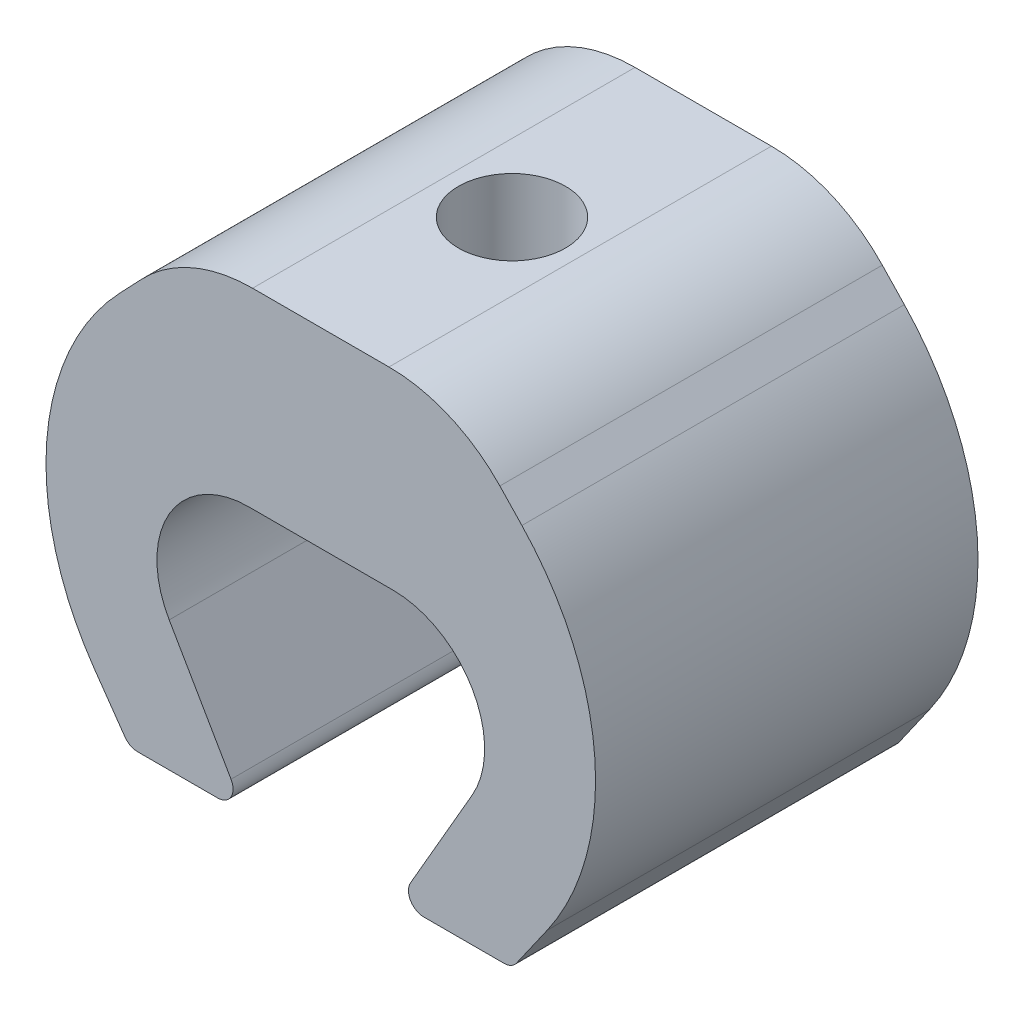
ISO-10303-21;
HEADER;
FILE_DESCRIPTION(('STEP AP214'),'2;1');
FILE_NAME('part.step','',(''),(''),'','','');
FILE_SCHEMA(('AUTOMOTIVE_DESIGN { 1 0 10303 214 1 1 1 1 }'));
ENDSEC;
DATA;
#1=APPLICATION_CONTEXT('core data for automotive mechanical design processes');
#2=APPLICATION_PROTOCOL_DEFINITION('international standard','automotive_design',2000,#1);
#3=PRODUCT_CONTEXT('',#1,'mechanical');
#4=PRODUCT('Part','Part','',(#3));
#5=PRODUCT_RELATED_PRODUCT_CATEGORY('part','',(#4));
#6=PRODUCT_DEFINITION_FORMATION('','',#4);
#7=PRODUCT_DEFINITION_CONTEXT('part definition',#1,'design');
#8=PRODUCT_DEFINITION('design','',#6,#7);
#9=PRODUCT_DEFINITION_SHAPE('','',#8);
#10=(LENGTH_UNIT() NAMED_UNIT(*) SI_UNIT(.MILLI.,.METRE.));
#11=(NAMED_UNIT(*) PLANE_ANGLE_UNIT() SI_UNIT($,.RADIAN.));
#12=(NAMED_UNIT(*) SI_UNIT($,.STERADIAN.) SOLID_ANGLE_UNIT());
#13=UNCERTAINTY_MEASURE_WITH_UNIT(LENGTH_MEASURE(1.E-05),#10,'distance_accuracy_value','');
#14=(GEOMETRIC_REPRESENTATION_CONTEXT(3) GLOBAL_UNCERTAINTY_ASSIGNED_CONTEXT((#13)) GLOBAL_UNIT_ASSIGNED_CONTEXT((#10,
#11,#12)) REPRESENTATION_CONTEXT('',''));
#15=CARTESIAN_POINT('',(0.,0.,0.));
#16=DIRECTION('',(0.,0.,1.));
#17=DIRECTION('',(1.,0.,0.));
#18=AXIS2_PLACEMENT_3D('',#15,#16,#17);
#19=CARTESIAN_POINT('',(46.0062261462911,-5.,45.));
#20=DIRECTION('',(-0.819152044288995,0.573576436351042,0.));
#21=DIRECTION('',(-0.573576436351042,-0.819152044288995,0.));
#22=AXIS2_PLACEMENT_3D('',#19,#20,#21);
#23=PLANE('',#22);
#24=DIRECTION('',(-0.573576436351042,-0.819152044288995,0.));
#25=VECTOR('',#24,1.);
#26=CARTESIAN_POINT('',(46.0062261462911,-5.,-5.));
#27=LINE('',#26,#25);
#28=CARTESIAN_POINT('',(29.5931769100818,-28.4402635512527,-5.));
#29=VERTEX_POINT('',#28);
#30=CARTESIAN_POINT('',(25.5971699874745,-34.1471528727021,-5.));
#31=VERTEX_POINT('',#30);
#32=EDGE_CURVE('E568',#29,#31,#27,.T.);
#33=ORIENTED_EDGE('',*,*,#32,.F.);
#34=DIRECTION('',(0.,0.,-1.));
#35=VECTOR('',#34,1.);
#36=CARTESIAN_POINT('',(29.5931769100818,-28.4402635512527,45.));
#37=LINE('',#36,#35);
#38=CARTESIAN_POINT('',(29.5931769100818,-28.4402635512527,45.));
#39=VERTEX_POINT('',#38);
#40=EDGE_CURVE('E540',#29,#39,#37,.F.);
#41=ORIENTED_EDGE('',*,*,#40,.T.);
#42=DIRECTION('',(0.573576436351042,0.819152044288995,0.));
#43=VECTOR('',#42,1.);
#44=CARTESIAN_POINT('',(46.0062261462911,-5.,45.));
#45=LINE('',#44,#43);
#46=CARTESIAN_POINT('',(25.5971699874745,-34.1471528727021,45.));
#47=VERTEX_POINT('',#46);
#48=EDGE_CURVE('E578',#47,#39,#45,.T.);
#49=ORIENTED_EDGE('',*,*,#48,.F.);
#50=DIRECTION('',(0.,0.,-1.));
#51=VECTOR('',#50,1.);
#52=CARTESIAN_POINT('',(25.5971699874745,-34.1471528727021,45.));
#53=LINE('',#52,#51);
#54=EDGE_CURVE('E261',#47,#31,#53,.T.);
#55=ORIENTED_EDGE('',*,*,#54,.T.);
#56=EDGE_LOOP('',(#33,#41,#49,#55));
#57=FACE_BOUND('',#56,.T.);
#58=ADVANCED_FACE('F47',(#57),#23,.F.);
#59=CARTESIAN_POINT('',(17.5,25.,45.));
#60=DIRECTION('',(-0.724924303385379,-0.688828537708204,0.));
#61=DIRECTION('',(0.688828537708204,-0.724924303385379,0.));
#62=AXIS2_PLACEMENT_3D('',#59,#60,#61);
#63=PLANE('',#62);
#64=DIRECTION('',(-0.688828537708204,0.724924303385379,0.));
#65=VECTOR('',#64,1.);
#66=CARTESIAN_POINT('',(17.5,25.,45.));
#67=LINE('',#66,#65);
#68=CARTESIAN_POINT('',(26.2952059784553,15.743910540821,45.));
#69=VERTEX_POINT('',#68);
#70=CARTESIAN_POINT('',(23.413549382908,18.7765707541641,45.));
#71=VERTEX_POINT('',#70);
#72=EDGE_CURVE('E581',#69,#71,#67,.T.);
#73=ORIENTED_EDGE('',*,*,#72,.F.);
#74=DIRECTION('',(0.,0.,-1.));
#75=VECTOR('',#74,1.);
#76=CARTESIAN_POINT('',(26.2952059784553,15.743910540821,45.));
#77=LINE('',#76,#75);
#78=CARTESIAN_POINT('',(26.2952059784553,15.743910540821,-5.));
#79=VERTEX_POINT('',#78);
#80=EDGE_CURVE('E530',#69,#79,#77,.T.);
#81=ORIENTED_EDGE('',*,*,#80,.T.);
#82=DIRECTION('',(0.688828537708204,-0.724924303385379,0.));
#83=VECTOR('',#82,1.);
#84=CARTESIAN_POINT('',(17.5,25.,-5.));
#85=LINE('',#84,#83);
#86=CARTESIAN_POINT('',(23.413549382908,18.7765707541641,-5.));
#87=VERTEX_POINT('',#86);
#88=EDGE_CURVE('E231',#87,#79,#85,.T.);
#89=ORIENTED_EDGE('',*,*,#88,.F.);
#90=DIRECTION('',(0.,0.,-1.));
#91=VECTOR('',#90,1.);
#92=CARTESIAN_POINT('',(23.413549382908,18.7765707541641,45.));
#93=LINE('',#92,#91);
#94=EDGE_CURVE('E249',#87,#71,#93,.F.);
#95=ORIENTED_EDGE('',*,*,#94,.T.);
#96=EDGE_LOOP('',(#73,#81,#89,#95));
#97=FACE_BOUND('',#96,.T.);
#98=ADVANCED_FACE('F415',(#97),#63,.F.);
#99=CARTESIAN_POINT('',(-17.5,25.,45.));
#100=DIRECTION('',(0.,-1.,0.));
#101=DIRECTION('',(0.,0.,-1.));
#102=AXIS2_PLACEMENT_3D('',#99,#100,#101);
#103=PLANE('',#102);
#104=CARTESIAN_POINT('',(0.,25.,20.));
#105=DIRECTION('',(0.,1.,0.));
#106=DIRECTION('',(0.,0.,1.));
#107=AXIS2_PLACEMENT_3D('',#104,#105,#106);
#108=CIRCLE('',#107,6.99999999999999);
#109=CARTESIAN_POINT('',(0.,25.,27.));
#110=VERTEX_POINT('',#109);
#111=EDGE_CURVE('E334',#110,#110,#108,.T.);
#112=ORIENTED_EDGE('',*,*,#111,.F.);
#113=EDGE_LOOP('',(#112));
#114=FACE_BOUND('',#113,.T.);
#115=DIRECTION('',(-1.,0.,0.));
#116=VECTOR('',#115,1.);
#117=CARTESIAN_POINT('',(-17.5,25.,45.));
#118=LINE('',#117,#116);
#119=CARTESIAN_POINT('',(8.91506331520043,25.,45.));
#120=VERTEX_POINT('',#119);
#121=CARTESIAN_POINT('',(-8.91506331520043,25.,45.));
#122=VERTEX_POINT('',#121);
#123=EDGE_CURVE('E584',#120,#122,#118,.T.);
#124=ORIENTED_EDGE('',*,*,#123,.F.);
#125=DIRECTION('',(0.,0.,-1.));
#126=VECTOR('',#125,1.);
#127=CARTESIAN_POINT('',(8.91506331520043,25.,45.));
#128=LINE('',#127,#126);
#129=CARTESIAN_POINT('',(8.91506331520043,25.,-5.));
#130=VERTEX_POINT('',#129);
#131=EDGE_CURVE('E221',#120,#130,#128,.T.);
#132=ORIENTED_EDGE('',*,*,#131,.T.);
#133=DIRECTION('',(1.,0.,0.));
#134=VECTOR('',#133,1.);
#135=CARTESIAN_POINT('',(-17.5,25.,-5.));
#136=LINE('',#135,#134);
#137=CARTESIAN_POINT('',(-8.91506331520043,25.,-5.));
#138=VERTEX_POINT('',#137);
#139=EDGE_CURVE('E213',#138,#130,#136,.T.);
#140=ORIENTED_EDGE('',*,*,#139,.F.);
#141=DIRECTION('',(0.,0.,-1.));
#142=VECTOR('',#141,1.);
#143=CARTESIAN_POINT('',(-8.91506331520043,25.,45.));
#144=LINE('',#143,#142);
#145=EDGE_CURVE('E227',#138,#122,#144,.F.);
#146=ORIENTED_EDGE('',*,*,#145,.T.);
#147=EDGE_LOOP('',(#124,#132,#140,#146));
#148=FACE_BOUND('',#147,.T.);
#149=ADVANCED_FACE('F226',(#114,#148),#103,.F.);
#150=CARTESIAN_POINT('',(-17.5,25.,45.));
#151=DIRECTION('',(0.724924303385379,-0.688828537708204,0.));
#152=DIRECTION('',(0.688828537708204,0.724924303385379,0.));
#153=AXIS2_PLACEMENT_3D('',#150,#151,#152);
#154=PLANE('',#153);
#155=DIRECTION('',(0.688828537708204,0.724924303385379,0.));
#156=VECTOR('',#155,1.);
#157=CARTESIAN_POINT('',(-46.0062261462911,-5.,-5.));
#158=LINE('',#157,#156);
#159=CARTESIAN_POINT('',(-26.2952059784553,15.743910540821,-5.));
#160=VERTEX_POINT('',#159);
#161=CARTESIAN_POINT('',(-23.413549382908,18.7765707541641,-5.));
#162=VERTEX_POINT('',#161);
#163=EDGE_CURVE('E214',#160,#162,#158,.T.);
#164=ORIENTED_EDGE('',*,*,#163,.F.);
#165=DIRECTION('',(0.,0.,-1.));
#166=VECTOR('',#165,1.);
#167=CARTESIAN_POINT('',(-26.2952059784553,15.743910540821,45.));
#168=LINE('',#167,#166);
#169=CARTESIAN_POINT('',(-26.2952059784553,15.743910540821,45.));
#170=VERTEX_POINT('',#169);
#171=EDGE_CURVE('E11',#160,#170,#168,.F.);
#172=ORIENTED_EDGE('',*,*,#171,.T.);
#173=DIRECTION('',(-0.688828537708204,-0.724924303385379,0.));
#174=VECTOR('',#173,1.);
#175=CARTESIAN_POINT('',(-17.5,25.,45.));
#176=LINE('',#175,#174);
#177=CARTESIAN_POINT('',(-23.413549382908,18.7765707541641,45.));
#178=VERTEX_POINT('',#177);
#179=EDGE_CURVE('E587',#178,#170,#176,.T.);
#180=ORIENTED_EDGE('',*,*,#179,.F.);
#181=DIRECTION('',(0.,0.,-1.));
#182=VECTOR('',#181,1.);
#183=CARTESIAN_POINT('',(-23.413549382908,18.7765707541641,45.));
#184=LINE('',#183,#182);
#185=EDGE_CURVE('E258',#178,#162,#184,.T.);
#186=ORIENTED_EDGE('',*,*,#185,.T.);
#187=EDGE_LOOP('',(#164,#172,#180,#186));
#188=FACE_BOUND('',#187,.T.);
#189=ADVANCED_FACE('F409',(#188),#154,.F.);
#190=CARTESIAN_POINT('',(-46.0062261462911,-5.,45.));
#191=DIRECTION('',(0.819152044288995,0.573576436351042,0.));
#192=DIRECTION('',(-0.573576436351042,0.819152044288995,0.));
#193=AXIS2_PLACEMENT_3D('',#190,#191,#192);
#194=PLANE('',#193);
#195=DIRECTION('',(0.573576436351042,-0.819152044288995,0.));
#196=VECTOR('',#195,1.);
#197=CARTESIAN_POINT('',(-46.0062261462911,-5.,45.));
#198=LINE('',#197,#196);
#199=CARTESIAN_POINT('',(-29.5931769100818,-28.4402635512526,45.));
#200=VERTEX_POINT('',#199);
#201=CARTESIAN_POINT('',(-25.5971699874745,-34.1471528727021,45.));
#202=VERTEX_POINT('',#201);
#203=EDGE_CURVE('E554',#200,#202,#198,.T.);
#204=ORIENTED_EDGE('',*,*,#203,.F.);
#205=DIRECTION('',(0.,0.,-1.));
#206=VECTOR('',#205,1.);
#207=CARTESIAN_POINT('',(-29.5931769100818,-28.4402635512527,45.));
#208=LINE('',#207,#206);
#209=CARTESIAN_POINT('',(-29.5931769100818,-28.4402635512527,-5.));
#210=VERTEX_POINT('',#209);
#211=EDGE_CURVE('E56',#200,#210,#208,.T.);
#212=ORIENTED_EDGE('',*,*,#211,.T.);
#213=DIRECTION('',(-0.573576436351042,0.819152044288995,0.));
#214=VECTOR('',#213,1.);
#215=CARTESIAN_POINT('',(-25.,-35.,-5.));
#216=LINE('',#215,#214);
#217=CARTESIAN_POINT('',(-25.5971699874745,-34.1471528727021,-5.));
#218=VERTEX_POINT('',#217);
#219=EDGE_CURVE('E552',#218,#210,#216,.T.);
#220=ORIENTED_EDGE('',*,*,#219,.F.);
#221=DIRECTION('',(0.,0.,-1.));
#222=VECTOR('',#221,1.);
#223=CARTESIAN_POINT('',(-25.5971699874745,-34.1471528727021,45.));
#224=LINE('',#223,#222);
#225=EDGE_CURVE('E300',#218,#202,#224,.F.);
#226=ORIENTED_EDGE('',*,*,#225,.T.);
#227=EDGE_LOOP('',(#204,#212,#220,#226));
#228=FACE_BOUND('',#227,.T.);
#229=ADVANCED_FACE('F403',(#228),#194,.F.);
#230=CARTESIAN_POINT('',(-25.,-35.,45.));
#231=DIRECTION('',(0.,1.,0.));
#232=DIRECTION('',(-1.,0.,0.));
#233=AXIS2_PLACEMENT_3D('',#230,#231,#232);
#234=PLANE('',#233);
#235=DIRECTION('',(-1.,0.,0.));
#236=VECTOR('',#235,1.);
#237=CARTESIAN_POINT('',(25.,-35.,-5.));
#238=LINE('',#237,#236);
#239=CARTESIAN_POINT('',(23.9588658988965,-35.,-5.));
#240=VERTEX_POINT('',#239);
#241=CARTESIAN_POINT('',(-23.9588658988965,-35.,-5.));
#242=VERTEX_POINT('',#241);
#243=EDGE_CURVE('E558',#240,#242,#238,.T.);
#244=ORIENTED_EDGE('',*,*,#243,.F.);
#245=DIRECTION('',(0.,0.,-1.));
#246=VECTOR('',#245,1.);
#247=CARTESIAN_POINT('',(23.9588658988965,-35.,45.));
#248=LINE('',#247,#246);
#249=CARTESIAN_POINT('',(23.9588658988965,-35.,45.));
#250=VERTEX_POINT('',#249);
#251=EDGE_CURVE('E282',#240,#250,#248,.F.);
#252=ORIENTED_EDGE('',*,*,#251,.T.);
#253=DIRECTION('',(1.,0.,0.));
#254=VECTOR('',#253,1.);
#255=CARTESIAN_POINT('',(10.,-35.,45.));
#256=LINE('',#255,#254);
#257=CARTESIAN_POINT('',(13.4641016151378,-35.,45.));
#258=VERTEX_POINT('',#257);
#259=EDGE_CURVE('E571',#258,#250,#256,.T.);
#260=ORIENTED_EDGE('',*,*,#259,.F.);
#261=DIRECTION('',(0.,0.,-1.));
#262=VECTOR('',#261,1.);
#263=CARTESIAN_POINT('',(13.4641016151378,-35.,45.));
#264=LINE('',#263,#262);
#265=CARTESIAN_POINT('',(13.4641016151378,-35.,2.));
#266=VERTEX_POINT('',#265);
#267=EDGE_CURVE('E278',#258,#266,#264,.T.);
#268=ORIENTED_EDGE('',*,*,#267,.T.);
#269=CARTESIAN_POINT('',(10.,-35.,0.));
#270=CARTESIAN_POINT('',(10.0856953170134,-35.,-1.18494145618116E-05));
#271=CARTESIAN_POINT('',(10.1713405556404,-35.,0.00412893975098654));
#272=CARTESIAN_POINT('',(10.341780590329,-35.,0.0201470604537437));
#273=CARTESIAN_POINT('',(10.426576481521,-35.,0.0320126185143969));
#274=CARTESIAN_POINT('',(10.5938184698306,-35.,0.0627287730667146));
#275=CARTESIAN_POINT('',(10.6762805683193,-35.,0.0814935023678115));
#276=CARTESIAN_POINT('',(10.8395026629734,-35.,0.125438829067984));
#277=CARTESIAN_POINT('',(10.920261826048,-35.,0.150622491280376));
#278=CARTESIAN_POINT('',(11.1093691200513,-35.,0.217247054259641));
#279=CARTESIAN_POINT('',(11.2168174585352,-35.,0.261251612167699));
#280=CARTESIAN_POINT('',(11.4274088478646,-35.,0.35864571731869));
#281=CARTESIAN_POINT('',(11.5305483730236,-35.,0.412042770787789));
#282=CARTESIAN_POINT('',(11.8341029473315,-35.,0.584537547610508));
#283=CARTESIAN_POINT('',(12.0277329944621,-35.,0.715590657663827));
#284=CARTESIAN_POINT('',(12.4372179209969,-35.,1.02724023040323));
#285=CARTESIAN_POINT('',(12.6493864639236,-35.,1.21247748048099));
#286=CARTESIAN_POINT('',(13.0603182469414,-35.,1.59635845323979));
#287=CARTESIAN_POINT('',(13.2590917742399,-35.,1.7949916479083));
#288=CARTESIAN_POINT('',(13.4598852469932,-35.,1.99578363203123));
#289=CARTESIAN_POINT('',(13.4619934321363,-35.,1.99789181717858));
#290=CARTESIAN_POINT('',(13.4641016151378,-35.,2.));
#291=B_SPLINE_CURVE_WITH_KNOTS('',3,(#269,#270,#271,#272,#273,#274,#275,#276,#277,#278,#279,
#280,#281,#282,#283,#284,#285,#286,#287,#288,#289,#290),.UNSPECIFIED.,.F.,.F.,(4,2,2,2,2,2,2,2,
2,2,4),(0.,0.256912595777618,0.513434539684654,0.766866291390108,1.02041927520561,
1.36819331305836,1.71624655574954,2.41527069662684,3.25887239086151,4.10181864660848,
4.11076291851908),.UNSPECIFIED.);
#292=CARTESIAN_POINT('',(10.,-35.,0.));
#293=VERTEX_POINT('',#292);
#294=EDGE_CURVE('E377',#266,#293,#291,.F.);
#295=ORIENTED_EDGE('',*,*,#294,.T.);
#296=DIRECTION('',(-1.,0.,0.));
#297=VECTOR('',#296,1.);
#298=CARTESIAN_POINT('',(-10.,-35.,0.));
#299=LINE('',#298,#297);
#300=CARTESIAN_POINT('',(-10.,-35.,0.));
#301=VERTEX_POINT('',#300);
#302=EDGE_CURVE('E333',#293,#301,#299,.T.);
#303=ORIENTED_EDGE('',*,*,#302,.T.);
#304=CARTESIAN_POINT('',(-10.,-35.,0.));
#305=CARTESIAN_POINT('',(-10.0856953170135,-35.,-1.18494145626474E-05));
#306=CARTESIAN_POINT('',(-10.1713405556406,-35.,0.00412893975099669));
#307=CARTESIAN_POINT('',(-10.3417805903295,-35.,0.0201470604537966));
#308=CARTESIAN_POINT('',(-10.4265764815216,-35.,0.032012618514482));
#309=CARTESIAN_POINT('',(-10.5938184698312,-35.,0.0627287730668392));
#310=CARTESIAN_POINT('',(-10.6762805683198,-35.,0.0814935023679238));
#311=CARTESIAN_POINT('',(-10.8395026629737,-35.,0.125438829068053));
#312=CARTESIAN_POINT('',(-10.9202618260482,-35.,0.150622491280414));
#313=CARTESIAN_POINT('',(-11.1093691200512,-35.,0.217247054259603));
#314=CARTESIAN_POINT('',(-11.216817458535,-35.,0.261251612167612));
#315=CARTESIAN_POINT('',(-11.4274088478642,-35.,0.358645717318526));
#316=CARTESIAN_POINT('',(-11.5305483730231,-35.,0.412042770787599));
#317=CARTESIAN_POINT('',(-11.8341029473313,-35.,0.584537547610236));
#318=CARTESIAN_POINT('',(-12.0277329944623,-35.,0.715590657663365));
#319=CARTESIAN_POINT('',(-12.4372179209965,-35.,1.02724023040371));
#320=CARTESIAN_POINT('',(-12.649386463922,-35.,1.21247748048289));
#321=CARTESIAN_POINT('',(-13.0603182469433,-35.,1.59635845323817));
#322=CARTESIAN_POINT('',(-13.2590917742467,-35.,1.79499164790174));
#323=CARTESIAN_POINT('',(-13.4598852469934,-35.,1.99578363203109));
#324=CARTESIAN_POINT('',(-13.4619934321364,-35.,1.99789181717851));
#325=CARTESIAN_POINT('',(-13.4641016151378,-35.,2.));
#326=B_SPLINE_CURVE_WITH_KNOTS('',3,(#304,#305,#306,#307,#308,#309,#310,#311,#312,#313,#314,
#315,#316,#317,#318,#319,#320,#321,#322,#323,#324,#325),.UNSPECIFIED.,.F.,.F.,(4,2,2,2,2,2,2,2,
2,2,4),(0.,0.256912595777959,0.513434539685356,0.766866291390465,1.02041927520561,
1.36819331305806,1.71624655574899,2.41527069662684,3.25887239086182,4.10181864660849,
4.11076291851909),.UNSPECIFIED.);
#327=CARTESIAN_POINT('',(-13.4641016151378,-35.,2.));
#328=VERTEX_POINT('',#327);
#329=EDGE_CURVE('E386',#301,#328,#326,.T.);
#330=ORIENTED_EDGE('',*,*,#329,.T.);
#331=DIRECTION('',(0.,0.,-1.));
#332=VECTOR('',#331,1.);
#333=CARTESIAN_POINT('',(-13.4641016151378,-35.,45.));
#334=LINE('',#333,#332);
#335=CARTESIAN_POINT('',(-13.4641016151378,-35.,45.));
#336=VERTEX_POINT('',#335);
#337=EDGE_CURVE('E271',#328,#336,#334,.F.);
#338=ORIENTED_EDGE('',*,*,#337,.T.);
#339=DIRECTION('',(1.,0.,0.));
#340=VECTOR('',#339,1.);
#341=CARTESIAN_POINT('',(-25.,-35.,45.));
#342=LINE('',#341,#340);
#343=CARTESIAN_POINT('',(-23.9588658988965,-35.,45.));
#344=VERTEX_POINT('',#343);
#345=EDGE_CURVE('E592',#344,#336,#342,.T.);
#346=ORIENTED_EDGE('',*,*,#345,.F.);
#347=DIRECTION('',(0.,0.,-1.));
#348=VECTOR('',#347,1.);
#349=CARTESIAN_POINT('',(-23.9588658988965,-35.,45.));
#350=LINE('',#349,#348);
#351=EDGE_CURVE('E274',#344,#242,#350,.T.);
#352=ORIENTED_EDGE('',*,*,#351,.T.);
#353=EDGE_LOOP('',(#244,#252,#260,#268,#295,#303,#330,#338,#346,#352));
#354=FACE_BOUND('',#353,.T.);
#355=ADVANCED_FACE('F397',(#354),#234,.F.);
#356=CARTESIAN_POINT('',(-10.,-35.,45.));
#357=DIRECTION('',(-0.866025403784438,-0.500000000000001,0.));
#358=DIRECTION('',(0.500000000000001,-0.866025403784438,0.));
#359=AXIS2_PLACEMENT_3D('',#356,#357,#358);
#360=PLANE('',#359);
#361=DIRECTION('',(0.,0.,-1.));
#362=VECTOR('',#361,1.);
#363=CARTESIAN_POINT('',(-11.7320508075689,-32.,45.));
#364=LINE('',#363,#362);
#365=CARTESIAN_POINT('',(-11.7320508075689,-32.,45.));
#366=VERTEX_POINT('',#365);
#367=CARTESIAN_POINT('',(-11.7320508075689,-32.,2.));
#368=VERTEX_POINT('',#367);
#369=EDGE_CURVE('E304',#366,#368,#364,.T.);
#370=ORIENTED_EDGE('',*,*,#369,.T.);
#371=DIRECTION('',(-0.500000000000001,0.866025403784438,0.));
#372=VECTOR('',#371,1.);
#373=CARTESIAN_POINT('',(-19.8149545762237,-18.,2.));
#374=LINE('',#373,#372);
#375=CARTESIAN_POINT('',(-19.8149545762237,-18.,2.));
#376=VERTEX_POINT('',#375);
#377=EDGE_CURVE('E371',#368,#376,#374,.T.);
#378=ORIENTED_EDGE('',*,*,#377,.T.);
#379=DIRECTION('',(0.,0.,-1.));
#380=VECTOR('',#379,1.);
#381=CARTESIAN_POINT('',(-19.8149545762237,-18.,45.));
#382=LINE('',#381,#380);
#383=CARTESIAN_POINT('',(-19.8149545762237,-18.,45.));
#384=VERTEX_POINT('',#383);
#385=EDGE_CURVE('E319',#376,#384,#382,.F.);
#386=ORIENTED_EDGE('',*,*,#385,.T.);
#387=DIRECTION('',(-0.500000000000001,0.866025403784438,0.));
#388=VECTOR('',#387,1.);
#389=CARTESIAN_POINT('',(-10.,-35.,45.));
#390=LINE('',#389,#388);
#391=EDGE_CURVE('E596',#366,#384,#390,.T.);
#392=ORIENTED_EDGE('',*,*,#391,.F.);
#393=EDGE_LOOP('',(#370,#378,#386,#392));
#394=FACE_BOUND('',#393,.T.);
#395=ADVANCED_FACE('F402',(#394),#360,.F.);
#396=CARTESIAN_POINT('',(-30.207259421637,0.,45.));
#397=DIRECTION('',(0.,1.,0.));
#398=DIRECTION('',(0.,0.,1.));
#399=AXIS2_PLACEMENT_3D('',#396,#397,#398);
#400=PLANE('',#399);
#401=CARTESIAN_POINT('',(0.,0.,20.));
#402=DIRECTION('',(0.,1.,0.));
#403=DIRECTION('',(0.,0.,1.));
#404=AXIS2_PLACEMENT_3D('',#401,#402,#403);
#405=CIRCLE('',#404,6.99999999999999);
#406=CARTESIAN_POINT('',(0.,0.,27.));
#407=VERTEX_POINT('',#406);
#408=EDGE_CURVE('E329',#407,#407,#405,.T.);
#409=ORIENTED_EDGE('',*,*,#408,.T.);
#410=EDGE_LOOP('',(#409));
#411=FACE_BOUND('',#410,.T.);
#412=DIRECTION('',(0.,0.,-1.));
#413=VECTOR('',#412,1.);
#414=CARTESIAN_POINT('',(-9.42264973081042,0.,0.));
#415=LINE('',#414,#413);
#416=CARTESIAN_POINT('',(-9.42264973081042,0.,45.));
#417=VERTEX_POINT('',#416);
#418=CARTESIAN_POINT('',(-9.42264973081042,0.,2.));
#419=VERTEX_POINT('',#418);
#420=EDGE_CURVE('E312',#417,#419,#415,.T.);
#421=ORIENTED_EDGE('',*,*,#420,.T.);
#422=DIRECTION('',(1.,0.,0.));
#423=VECTOR('',#422,1.);
#424=CARTESIAN_POINT('',(9.42264973081039,0.,2.));
#425=LINE('',#424,#423);
#426=CARTESIAN_POINT('',(9.42264973081041,0.,2.));
#427=VERTEX_POINT('',#426);
#428=EDGE_CURVE('E365',#419,#427,#425,.T.);
#429=ORIENTED_EDGE('',*,*,#428,.T.);
#430=DIRECTION('',(0.,0.,-1.));
#431=VECTOR('',#430,1.);
#432=CARTESIAN_POINT('',(9.42264973081041,0.,45.));
#433=LINE('',#432,#431);
#434=CARTESIAN_POINT('',(9.42264973081039,0.,45.));
#435=VERTEX_POINT('',#434);
#436=EDGE_CURVE('E316',#427,#435,#433,.F.);
#437=ORIENTED_EDGE('',*,*,#436,.T.);
#438=DIRECTION('',(1.,0.,0.));
#439=VECTOR('',#438,1.);
#440=CARTESIAN_POINT('',(-30.207259421637,0.,45.));
#441=LINE('',#440,#439);
#442=EDGE_CURVE('E243',#417,#435,#441,.T.);
#443=ORIENTED_EDGE('',*,*,#442,.F.);
#444=EDGE_LOOP('',(#421,#429,#437,#443));
#445=FACE_BOUND('',#444,.T.);
#446=ADVANCED_FACE('F496',(#411,#445),#400,.F.);
#447=CARTESIAN_POINT('',(30.207259421637,0.,45.));
#448=DIRECTION('',(0.866025403784438,-0.500000000000001,0.));
#449=DIRECTION('',(0.500000000000001,0.866025403784438,0.));
#450=AXIS2_PLACEMENT_3D('',#447,#448,#449);
#451=PLANE('',#450);
#452=DIRECTION('',(0.,0.,-1.));
#453=VECTOR('',#452,1.);
#454=CARTESIAN_POINT('',(19.8149545762237,-18.,0.));
#455=LINE('',#454,#453);
#456=CARTESIAN_POINT('',(19.8149545762237,-18.,45.));
#457=VERTEX_POINT('',#456);
#458=CARTESIAN_POINT('',(19.8149545762237,-18.,2.));
#459=VERTEX_POINT('',#458);
#460=EDGE_CURVE('E308',#457,#459,#455,.T.);
#461=ORIENTED_EDGE('',*,*,#460,.T.);
#462=DIRECTION('',(-0.500000000000001,-0.866025403784438,0.));
#463=VECTOR('',#462,1.);
#464=CARTESIAN_POINT('',(11.7320508075689,-32.,2.));
#465=LINE('',#464,#463);
#466=CARTESIAN_POINT('',(11.7320508075689,-32.,2.));
#467=VERTEX_POINT('',#466);
#468=EDGE_CURVE('E359',#459,#467,#465,.T.);
#469=ORIENTED_EDGE('',*,*,#468,.T.);
#470=DIRECTION('',(0.,0.,-1.));
#471=VECTOR('',#470,1.);
#472=CARTESIAN_POINT('',(11.7320508075689,-32.,45.));
#473=LINE('',#472,#471);
#474=CARTESIAN_POINT('',(11.7320508075689,-32.,45.));
#475=VERTEX_POINT('',#474);
#476=EDGE_CURVE('E297',#467,#475,#473,.F.);
#477=ORIENTED_EDGE('',*,*,#476,.T.);
#478=DIRECTION('',(-0.500000000000001,-0.866025403784438,0.));
#479=VECTOR('',#478,1.);
#480=CARTESIAN_POINT('',(30.207259421637,0.,45.));
#481=LINE('',#480,#479);
#482=EDGE_CURVE('E237',#457,#475,#481,.T.);
#483=ORIENTED_EDGE('',*,*,#482,.F.);
#484=EDGE_LOOP('',(#461,#469,#477,#483));
#485=FACE_BOUND('',#484,.T.);
#486=ADVANCED_FACE('F506',(#485),#451,.F.);
#487=CARTESIAN_POINT('',(0.,0.,45.));
#488=DIRECTION('',(0.,0.,1.));
#489=DIRECTION('',(1.,0.,0.));
#490=AXIS2_PLACEMENT_3D('',#487,#488,#489);
#491=PLANE('',#490);
#492=ORIENTED_EDGE('',*,*,#48,.T.);
#493=CARTESIAN_POINT('',(0.922855359967022,-8.3650882789662,45.));
#494=DIRECTION('',(0.,0.,1.));
#495=DIRECTION('',(1.,0.,0.));
#496=AXIS2_PLACEMENT_3D('',#493,#494,#495);
#497=CIRCLE('',#496,35.);
#498=EDGE_CURVE('E545',#39,#69,#497,.T.);
#499=ORIENTED_EDGE('',*,*,#498,.T.);
#500=ORIENTED_EDGE('',*,*,#72,.T.);
#501=CARTESIAN_POINT('',(8.91506331520043,5.,45.));
#502=DIRECTION('',(0.,0.,1.));
#503=DIRECTION('',(1.,0.,0.));
#504=AXIS2_PLACEMENT_3D('',#501,#502,#503);
#505=CIRCLE('',#504,20.);
#506=EDGE_CURVE('E255',#71,#120,#505,.T.);
#507=ORIENTED_EDGE('',*,*,#506,.T.);
#508=ORIENTED_EDGE('',*,*,#123,.T.);
#509=CARTESIAN_POINT('',(-8.91506331520043,5.,45.));
#510=DIRECTION('',(0.,0.,1.));
#511=DIRECTION('',(1.,0.,0.));
#512=AXIS2_PLACEMENT_3D('',#509,#510,#511);
#513=CIRCLE('',#512,20.);
#514=EDGE_CURVE('E235',#122,#178,#513,.T.);
#515=ORIENTED_EDGE('',*,*,#514,.T.);
#516=ORIENTED_EDGE('',*,*,#179,.T.);
#517=CARTESIAN_POINT('',(-0.922855359967011,-8.36508827896619,45.));
#518=DIRECTION('',(0.,0.,1.));
#519=DIRECTION('',(1.,0.,0.));
#520=AXIS2_PLACEMENT_3D('',#517,#518,#519);
#521=CIRCLE('',#520,35.);
#522=EDGE_CURVE('E63',#170,#200,#521,.T.);
#523=ORIENTED_EDGE('',*,*,#522,.T.);
#524=ORIENTED_EDGE('',*,*,#203,.T.);
#525=CARTESIAN_POINT('',(-23.9588658988965,-33.,45.));
#526=DIRECTION('',(0.,0.,1.));
#527=DIRECTION('',(1.,0.,0.));
#528=AXIS2_PLACEMENT_3D('',#525,#526,#527);
#529=CIRCLE('',#528,2.);
#530=EDGE_CURVE('E288',#202,#344,#529,.T.);
#531=ORIENTED_EDGE('',*,*,#530,.T.);
#532=ORIENTED_EDGE('',*,*,#345,.T.);
#533=CARTESIAN_POINT('',(-13.4641016151378,-33.,45.));
#534=DIRECTION('',(0.,0.,1.));
#535=DIRECTION('',(1.,0.,0.));
#536=AXIS2_PLACEMENT_3D('',#533,#534,#535);
#537=CIRCLE('',#536,2.);
#538=EDGE_CURVE('E285',#336,#366,#537,.T.);
#539=ORIENTED_EDGE('',*,*,#538,.T.);
#540=ORIENTED_EDGE('',*,*,#391,.T.);
#541=CARTESIAN_POINT('',(-9.42264973081042,-12.,45.));
#542=DIRECTION('',(0.,0.,1.));
#543=DIRECTION('',(1.,0.,0.));
#544=AXIS2_PLACEMENT_3D('',#541,#542,#543);
#545=CIRCLE('',#544,12.);
#546=EDGE_CURVE('E325',#384,#417,#545,.F.);
#547=ORIENTED_EDGE('',*,*,#546,.T.);
#548=ORIENTED_EDGE('',*,*,#442,.T.);
#549=CARTESIAN_POINT('',(9.42264973081041,-12.,45.));
#550=DIRECTION('',(0.,0.,1.));
#551=DIRECTION('',(1.,0.,0.));
#552=AXIS2_PLACEMENT_3D('',#549,#550,#551);
#553=CIRCLE('',#552,12.);
#554=EDGE_CURVE('E322',#435,#457,#553,.F.);
#555=ORIENTED_EDGE('',*,*,#554,.T.);
#556=ORIENTED_EDGE('',*,*,#482,.T.);
#557=CARTESIAN_POINT('',(13.4641016151378,-33.,45.));
#558=DIRECTION('',(0.,0.,1.));
#559=DIRECTION('',(1.,0.,0.));
#560=AXIS2_PLACEMENT_3D('',#557,#558,#559);
#561=CIRCLE('',#560,2.);
#562=EDGE_CURVE('E291',#475,#258,#561,.T.);
#563=ORIENTED_EDGE('',*,*,#562,.T.);
#564=ORIENTED_EDGE('',*,*,#259,.T.);
#565=CARTESIAN_POINT('',(23.9588658988965,-33.,45.));
#566=DIRECTION('',(0.,0.,1.));
#567=DIRECTION('',(1.,0.,0.));
#568=AXIS2_PLACEMENT_3D('',#565,#566,#567);
#569=CIRCLE('',#568,2.);
#570=EDGE_CURVE('E294',#250,#47,#569,.T.);
#571=ORIENTED_EDGE('',*,*,#570,.T.);
#572=EDGE_LOOP('',(#492,#499,#500,#507,#508,#515,#516,#523,#524,#531,#532,#539,#540,#547,#548,
#555,#556,#563,#564,#571));
#573=FACE_BOUND('',#572,.T.);
#574=ADVANCED_FACE('F503',(#573),#491,.T.);
#575=CARTESIAN_POINT('',(0.,0.,-5.));
#576=DIRECTION('',(0.,0.,-1.));
#577=DIRECTION('',(-1.,0.,0.));
#578=AXIS2_PLACEMENT_3D('',#575,#576,#577);
#579=PLANE('',#578);
#580=ORIENTED_EDGE('',*,*,#88,.T.);
#581=CARTESIAN_POINT('',(0.922855359967022,-8.3650882789662,-5.));
#582=DIRECTION('',(0.,0.,-1.));
#583=DIRECTION('',(-1.,0.,0.));
#584=AXIS2_PLACEMENT_3D('',#581,#582,#583);
#585=CIRCLE('',#584,35.);
#586=EDGE_CURVE('E537',#79,#29,#585,.T.);
#587=ORIENTED_EDGE('',*,*,#586,.T.);
#588=ORIENTED_EDGE('',*,*,#32,.T.);
#589=CARTESIAN_POINT('',(23.9588658988965,-33.,-5.));
#590=DIRECTION('',(0.,0.,-1.));
#591=DIRECTION('',(-1.,0.,0.));
#592=AXIS2_PLACEMENT_3D('',#589,#590,#591);
#593=CIRCLE('',#592,2.);
#594=EDGE_CURVE('E268',#31,#240,#593,.T.);
#595=ORIENTED_EDGE('',*,*,#594,.T.);
#596=ORIENTED_EDGE('',*,*,#243,.T.);
#597=CARTESIAN_POINT('',(-23.9588658988965,-33.,-5.));
#598=DIRECTION('',(0.,0.,-1.));
#599=DIRECTION('',(-1.,0.,0.));
#600=AXIS2_PLACEMENT_3D('',#597,#598,#599);
#601=CIRCLE('',#600,2.);
#602=EDGE_CURVE('E265',#242,#218,#601,.T.);
#603=ORIENTED_EDGE('',*,*,#602,.T.);
#604=ORIENTED_EDGE('',*,*,#219,.T.);
#605=CARTESIAN_POINT('',(-0.922855359967011,-8.36508827896619,-5.));
#606=DIRECTION('',(0.,0.,-1.));
#607=DIRECTION('',(-1.,0.,0.));
#608=AXIS2_PLACEMENT_3D('',#605,#606,#607);
#609=CIRCLE('',#608,35.);
#610=EDGE_CURVE('E534',#210,#160,#609,.T.);
#611=ORIENTED_EDGE('',*,*,#610,.T.);
#612=ORIENTED_EDGE('',*,*,#163,.T.);
#613=CARTESIAN_POINT('',(-8.91506331520043,5.,-5.));
#614=DIRECTION('',(0.,0.,-1.));
#615=DIRECTION('',(-1.,0.,0.));
#616=AXIS2_PLACEMENT_3D('',#613,#614,#615);
#617=CIRCLE('',#616,20.);
#618=EDGE_CURVE('E209',#162,#138,#617,.T.);
#619=ORIENTED_EDGE('',*,*,#618,.T.);
#620=ORIENTED_EDGE('',*,*,#139,.T.);
#621=CARTESIAN_POINT('',(8.91506331520043,5.,-5.));
#622=DIRECTION('',(0.,0.,-1.));
#623=DIRECTION('',(-1.,0.,0.));
#624=AXIS2_PLACEMENT_3D('',#621,#622,#623);
#625=CIRCLE('',#624,20.);
#626=EDGE_CURVE('E220',#130,#87,#625,.T.);
#627=ORIENTED_EDGE('',*,*,#626,.T.);
#628=EDGE_LOOP('',(#580,#587,#588,#595,#596,#603,#604,#611,#612,#619,#620,#627));
#629=FACE_BOUND('',#628,.T.);
#630=ADVANCED_FACE('F212',(#629),#579,.T.);
#631=CARTESIAN_POINT('',(0.,0.,0.));
#632=DIRECTION('',(0.,0.,-1.));
#633=DIRECTION('',(-1.,0.,0.));
#634=AXIS2_PLACEMENT_3D('',#631,#632,#633);
#635=PLANE('',#634);
#636=ORIENTED_EDGE('',*,*,#302,.F.);
#637=CARTESIAN_POINT('',(13.4641016151378,-33.,0.));
#638=DIRECTION('',(0.,0.,-1.));
#639=DIRECTION('',(-1.,0.,0.));
#640=AXIS2_PLACEMENT_3D('',#637,#638,#639);
#641=CIRCLE('',#640,4.);
#642=CARTESIAN_POINT('',(10.,-31.,0.));
#643=VERTEX_POINT('',#642);
#644=EDGE_CURVE('E352',#293,#643,#641,.T.);
#645=ORIENTED_EDGE('',*,*,#644,.T.);
#646=DIRECTION('',(-0.500000000000001,-0.866025403784438,0.));
#647=VECTOR('',#646,1.);
#648=CARTESIAN_POINT('',(18.0829037686548,-17.,0.));
#649=LINE('',#648,#647);
#650=CARTESIAN_POINT('',(18.0829037686548,-17.,0.));
#651=VERTEX_POINT('',#650);
#652=EDGE_CURVE('E349',#643,#651,#649,.F.);
#653=ORIENTED_EDGE('',*,*,#652,.T.);
#654=CARTESIAN_POINT('',(9.42264973081041,-12.,0.));
#655=DIRECTION('',(0.,0.,-1.));
#656=DIRECTION('',(-1.,0.,0.));
#657=AXIS2_PLACEMENT_3D('',#654,#655,#656);
#658=CIRCLE('',#657,10.);
#659=CARTESIAN_POINT('',(9.42264973081041,-2.,0.));
#660=VERTEX_POINT('',#659);
#661=EDGE_CURVE('E346',#651,#660,#658,.F.);
#662=ORIENTED_EDGE('',*,*,#661,.T.);
#663=DIRECTION('',(1.,0.,0.));
#664=VECTOR('',#663,1.);
#665=CARTESIAN_POINT('',(-9.42264973081042,-2.,0.));
#666=LINE('',#665,#664);
#667=CARTESIAN_POINT('',(-9.42264973081042,-2.,0.));
#668=VERTEX_POINT('',#667);
#669=EDGE_CURVE('E343',#660,#668,#666,.F.);
#670=ORIENTED_EDGE('',*,*,#669,.T.);
#671=CARTESIAN_POINT('',(-9.42264973081042,-12.,0.));
#672=DIRECTION('',(0.,0.,-1.));
#673=DIRECTION('',(-1.,0.,0.));
#674=AXIS2_PLACEMENT_3D('',#671,#672,#673);
#675=CIRCLE('',#674,10.);
#676=CARTESIAN_POINT('',(-18.0829037686548,-17.,0.));
#677=VERTEX_POINT('',#676);
#678=EDGE_CURVE('E328',#668,#677,#675,.F.);
#679=ORIENTED_EDGE('',*,*,#678,.T.);
#680=DIRECTION('',(-0.500000000000001,0.866025403784438,0.));
#681=VECTOR('',#680,1.);
#682=CARTESIAN_POINT('',(-10.,-31.,0.));
#683=LINE('',#682,#681);
#684=CARTESIAN_POINT('',(-10.,-31.,0.));
#685=VERTEX_POINT('',#684);
#686=EDGE_CURVE('E337',#677,#685,#683,.F.);
#687=ORIENTED_EDGE('',*,*,#686,.T.);
#688=CARTESIAN_POINT('',(-13.4641016151378,-33.,0.));
#689=DIRECTION('',(0.,0.,-1.));
#690=DIRECTION('',(-1.,0.,0.));
#691=AXIS2_PLACEMENT_3D('',#688,#689,#690);
#692=CIRCLE('',#691,4.);
#693=EDGE_CURVE('E340',#685,#301,#692,.T.);
#694=ORIENTED_EDGE('',*,*,#693,.T.);
#695=EDGE_LOOP('',(#636,#645,#653,#662,#670,#679,#687,#694));
#696=FACE_BOUND('',#695,.T.);
#697=ADVANCED_FACE('F426',(#696),#635,.F.);
#698=CARTESIAN_POINT('',(8.91506331520043,5.,45.));
#699=DIRECTION('',(0.,0.,-1.));
#700=DIRECTION('',(-1.,0.,0.));
#701=AXIS2_PLACEMENT_3D('',#698,#699,#700);
#702=CYLINDRICAL_SURFACE('',#701,20.);
#703=ORIENTED_EDGE('',*,*,#506,.F.);
#704=ORIENTED_EDGE('',*,*,#94,.F.);
#705=ORIENTED_EDGE('',*,*,#626,.F.);
#706=ORIENTED_EDGE('',*,*,#131,.F.);
#707=EDGE_LOOP('',(#703,#704,#705,#706));
#708=FACE_BOUND('',#707,.T.);
#709=ADVANCED_FACE('F423',(#708),#702,.T.);
#710=CARTESIAN_POINT('',(-8.91506331520043,5.,45.));
#711=DIRECTION('',(0.,0.,-1.));
#712=DIRECTION('',(-1.,0.,0.));
#713=AXIS2_PLACEMENT_3D('',#710,#711,#712);
#714=CYLINDRICAL_SURFACE('',#713,20.);
#715=ORIENTED_EDGE('',*,*,#514,.F.);
#716=ORIENTED_EDGE('',*,*,#145,.F.);
#717=ORIENTED_EDGE('',*,*,#618,.F.);
#718=ORIENTED_EDGE('',*,*,#185,.F.);
#719=EDGE_LOOP('',(#715,#716,#717,#718));
#720=FACE_BOUND('',#719,.T.);
#721=ADVANCED_FACE('F234',(#720),#714,.T.);
#722=CARTESIAN_POINT('',(23.9588658988965,-33.,45.));
#723=DIRECTION('',(0.,0.,-1.));
#724=DIRECTION('',(-1.,0.,0.));
#725=AXIS2_PLACEMENT_3D('',#722,#723,#724);
#726=CYLINDRICAL_SURFACE('',#725,2.);
#727=ORIENTED_EDGE('',*,*,#570,.F.);
#728=ORIENTED_EDGE('',*,*,#251,.F.);
#729=ORIENTED_EDGE('',*,*,#594,.F.);
#730=ORIENTED_EDGE('',*,*,#54,.F.);
#731=EDGE_LOOP('',(#727,#728,#729,#730));
#732=FACE_BOUND('',#731,.T.);
#733=ADVANCED_FACE('F430',(#732),#726,.T.);
#734=CARTESIAN_POINT('',(13.4641016151378,-33.,45.));
#735=DIRECTION('',(0.,0.,-1.));
#736=DIRECTION('',(-1.,0.,0.));
#737=AXIS2_PLACEMENT_3D('',#734,#735,#736);
#738=CYLINDRICAL_SURFACE('',#737,2.);
#739=ORIENTED_EDGE('',*,*,#476,.F.);
#740=CARTESIAN_POINT('',(13.4641016151378,-33.,2.));
#741=DIRECTION('',(0.,0.,-1.));
#742=DIRECTION('',(-1.,0.,0.));
#743=AXIS2_PLACEMENT_3D('',#740,#741,#742);
#744=CIRCLE('',#743,2.);
#745=EDGE_CURVE('E356',#467,#266,#744,.F.);
#746=ORIENTED_EDGE('',*,*,#745,.T.);
#747=ORIENTED_EDGE('',*,*,#267,.F.);
#748=ORIENTED_EDGE('',*,*,#562,.F.);
#749=EDGE_LOOP('',(#739,#746,#747,#748));
#750=FACE_BOUND('',#749,.T.);
#751=ADVANCED_FACE('F433',(#750),#738,.T.);
#752=CARTESIAN_POINT('',(-23.9588658988965,-33.,45.));
#753=DIRECTION('',(0.,0.,-1.));
#754=DIRECTION('',(-1.,0.,0.));
#755=AXIS2_PLACEMENT_3D('',#752,#753,#754);
#756=CYLINDRICAL_SURFACE('',#755,2.);
#757=ORIENTED_EDGE('',*,*,#530,.F.);
#758=ORIENTED_EDGE('',*,*,#225,.F.);
#759=ORIENTED_EDGE('',*,*,#602,.F.);
#760=ORIENTED_EDGE('',*,*,#351,.F.);
#761=EDGE_LOOP('',(#757,#758,#759,#760));
#762=FACE_BOUND('',#761,.T.);
#763=ADVANCED_FACE('F437',(#762),#756,.T.);
#764=CARTESIAN_POINT('',(-13.4641016151378,-33.,45.));
#765=DIRECTION('',(0.,0.,-1.));
#766=DIRECTION('',(-1.,0.,0.));
#767=AXIS2_PLACEMENT_3D('',#764,#765,#766);
#768=CYLINDRICAL_SURFACE('',#767,2.);
#769=ORIENTED_EDGE('',*,*,#337,.F.);
#770=CARTESIAN_POINT('',(-13.4641016151378,-33.,2.));
#771=DIRECTION('',(0.,0.,-1.));
#772=DIRECTION('',(-1.,0.,0.));
#773=AXIS2_PLACEMENT_3D('',#770,#771,#772);
#774=CIRCLE('',#773,2.);
#775=EDGE_CURVE('E368',#328,#368,#774,.F.);
#776=ORIENTED_EDGE('',*,*,#775,.T.);
#777=ORIENTED_EDGE('',*,*,#369,.F.);
#778=ORIENTED_EDGE('',*,*,#538,.F.);
#779=EDGE_LOOP('',(#769,#776,#777,#778));
#780=FACE_BOUND('',#779,.T.);
#781=ADVANCED_FACE('F441',(#780),#768,.T.);
#782=CARTESIAN_POINT('',(9.42264973081041,-12.,45.));
#783=DIRECTION('',(0.,0.,1.));
#784=DIRECTION('',(1.,0.,0.));
#785=AXIS2_PLACEMENT_3D('',#782,#783,#784);
#786=CYLINDRICAL_SURFACE('',#785,12.);
#787=ORIENTED_EDGE('',*,*,#436,.F.);
#788=CARTESIAN_POINT('',(9.42264973081041,-12.,2.));
#789=DIRECTION('',(0.,0.,-1.));
#790=DIRECTION('',(-1.,0.,0.));
#791=AXIS2_PLACEMENT_3D('',#788,#789,#790);
#792=CIRCLE('',#791,12.);
#793=EDGE_CURVE('E362',#427,#459,#792,.T.);
#794=ORIENTED_EDGE('',*,*,#793,.T.);
#795=ORIENTED_EDGE('',*,*,#460,.F.);
#796=ORIENTED_EDGE('',*,*,#554,.F.);
#797=EDGE_LOOP('',(#787,#794,#795,#796));
#798=FACE_BOUND('',#797,.T.);
#799=ADVANCED_FACE('F445',(#798),#786,.F.);
#800=CARTESIAN_POINT('',(-9.42264973081042,-12.,45.));
#801=DIRECTION('',(0.,0.,1.));
#802=DIRECTION('',(1.,0.,0.));
#803=AXIS2_PLACEMENT_3D('',#800,#801,#802);
#804=CYLINDRICAL_SURFACE('',#803,12.);
#805=ORIENTED_EDGE('',*,*,#385,.F.);
#806=CARTESIAN_POINT('',(-9.42264973081042,-12.,2.));
#807=DIRECTION('',(0.,0.,-1.));
#808=DIRECTION('',(-1.,0.,0.));
#809=AXIS2_PLACEMENT_3D('',#806,#807,#808);
#810=CIRCLE('',#809,12.);
#811=EDGE_CURVE('E374',#376,#419,#810,.T.);
#812=ORIENTED_EDGE('',*,*,#811,.T.);
#813=ORIENTED_EDGE('',*,*,#420,.F.);
#814=ORIENTED_EDGE('',*,*,#546,.F.);
#815=EDGE_LOOP('',(#805,#812,#813,#814));
#816=FACE_BOUND('',#815,.T.);
#817=ADVANCED_FACE('F448',(#816),#804,.F.);
#818=CARTESIAN_POINT('',(0.,25.,20.));
#819=DIRECTION('',(0.,1.,0.));
#820=DIRECTION('',(0.,0.,1.));
#821=AXIS2_PLACEMENT_3D('',#818,#819,#820);
#822=CYLINDRICAL_SURFACE('',#821,6.99999999999999);
#823=ORIENTED_EDGE('',*,*,#111,.T.);
#824=EDGE_LOOP('',(#823));
#825=FACE_BOUND('',#824,.T.);
#826=ORIENTED_EDGE('',*,*,#408,.F.);
#827=EDGE_LOOP('',(#826));
#828=FACE_BOUND('',#827,.T.);
#829=ADVANCED_FACE('F451',(#825,#828),#822,.F.);
#830=CARTESIAN_POINT('',(-13.4641016151378,-33.,2.));
#831=DIRECTION('',(0.,0.,-1.));
#832=DIRECTION('',(-1.,0.,0.));
#833=AXIS2_PLACEMENT_3D('',#830,#831,#832);
#834=TOROIDAL_SURFACE('',#833,4.,2.);
#835=ORIENTED_EDGE('',*,*,#329,.F.);
#836=ORIENTED_EDGE('',*,*,#693,.F.);
#837=CARTESIAN_POINT('',(-10.,-31.,2.));
#838=DIRECTION('',(0.500000000000001,-0.866025403784438,0.));
#839=DIRECTION('',(0.866025403784438,0.500000000000001,0.));
#840=AXIS2_PLACEMENT_3D('',#837,#838,#839);
#841=CIRCLE('',#840,2.);
#842=EDGE_CURVE('E478',#368,#685,#841,.T.);
#843=ORIENTED_EDGE('',*,*,#842,.F.);
#844=ORIENTED_EDGE('',*,*,#775,.F.);
#845=EDGE_LOOP('',(#835,#836,#843,#844));
#846=FACE_BOUND('',#845,.T.);
#847=ADVANCED_FACE('F457',(#846),#834,.F.);
#848=CARTESIAN_POINT('',(-8.26794919243113,-34.,2.));
#849=DIRECTION('',(0.500000000000001,-0.866025403784438,0.));
#850=DIRECTION('',(0.866025403784438,0.500000000000001,0.));
#851=AXIS2_PLACEMENT_3D('',#848,#849,#850);
#852=CYLINDRICAL_SURFACE('',#851,2.);
#853=ORIENTED_EDGE('',*,*,#842,.T.);
#854=ORIENTED_EDGE('',*,*,#686,.F.);
#855=CARTESIAN_POINT('',(-18.0829037686548,-17.,2.));
#856=DIRECTION('',(0.500000000000001,-0.866025403784438,0.));
#857=DIRECTION('',(0.866025403784438,0.500000000000001,0.));
#858=AXIS2_PLACEMENT_3D('',#855,#856,#857);
#859=CIRCLE('',#858,2.);
#860=EDGE_CURVE('E472',#376,#677,#859,.T.);
#861=ORIENTED_EDGE('',*,*,#860,.F.);
#862=ORIENTED_EDGE('',*,*,#377,.F.);
#863=EDGE_LOOP('',(#853,#854,#861,#862));
#864=FACE_BOUND('',#863,.T.);
#865=ADVANCED_FACE('F474',(#864),#852,.F.);
#866=CARTESIAN_POINT('',(-9.42264973081042,-12.,2.));
#867=DIRECTION('',(0.,0.,-1.));
#868=DIRECTION('',(-1.,0.,0.));
#869=AXIS2_PLACEMENT_3D('',#866,#867,#868);
#870=TOROIDAL_SURFACE('',#869,10.,2.);
#871=ORIENTED_EDGE('',*,*,#860,.T.);
#872=ORIENTED_EDGE('',*,*,#678,.F.);
#873=CARTESIAN_POINT('',(-9.42264973081042,-2.,2.));
#874=DIRECTION('',(-1.,0.,0.));
#875=DIRECTION('',(0.,0.,1.));
#876=AXIS2_PLACEMENT_3D('',#873,#874,#875);
#877=CIRCLE('',#876,2.);
#878=EDGE_CURVE('E479',#419,#668,#877,.T.);
#879=ORIENTED_EDGE('',*,*,#878,.F.);
#880=ORIENTED_EDGE('',*,*,#811,.F.);
#881=EDGE_LOOP('',(#871,#872,#879,#880));
#882=FACE_BOUND('',#881,.T.);
#883=ADVANCED_FACE('F482',(#882),#870,.F.);
#884=CARTESIAN_POINT('',(-30.207259421637,-2.,2.));
#885=DIRECTION('',(-1.,0.,0.));
#886=DIRECTION('',(0.,0.,1.));
#887=AXIS2_PLACEMENT_3D('',#884,#885,#886);
#888=CYLINDRICAL_SURFACE('',#887,2.);
#889=ORIENTED_EDGE('',*,*,#878,.T.);
#890=ORIENTED_EDGE('',*,*,#669,.F.);
#891=CARTESIAN_POINT('',(9.42264973081041,-2.,2.));
#892=DIRECTION('',(-1.,0.,0.));
#893=DIRECTION('',(0.,0.,1.));
#894=AXIS2_PLACEMENT_3D('',#891,#892,#893);
#895=CIRCLE('',#894,2.);
#896=EDGE_CURVE('E488',#427,#660,#895,.T.);
#897=ORIENTED_EDGE('',*,*,#896,.F.);
#898=ORIENTED_EDGE('',*,*,#428,.F.);
#899=EDGE_LOOP('',(#889,#890,#897,#898));
#900=FACE_BOUND('',#899,.T.);
#901=ADVANCED_FACE('F491',(#900),#888,.F.);
#902=CARTESIAN_POINT('',(9.42264973081041,-12.,2.));
#903=DIRECTION('',(0.,0.,-1.));
#904=DIRECTION('',(-1.,0.,0.));
#905=AXIS2_PLACEMENT_3D('',#902,#903,#904);
#906=TOROIDAL_SURFACE('',#905,10.,2.);
#907=ORIENTED_EDGE('',*,*,#896,.T.);
#908=ORIENTED_EDGE('',*,*,#661,.F.);
#909=CARTESIAN_POINT('',(18.0829037686548,-17.,2.));
#910=DIRECTION('',(0.500000000000001,0.866025403784438,0.));
#911=DIRECTION('',(-0.866025403784438,0.500000000000001,0.));
#912=AXIS2_PLACEMENT_3D('',#909,#910,#911);
#913=CIRCLE('',#912,2.);
#914=EDGE_CURVE('E522',#459,#651,#913,.T.);
#915=ORIENTED_EDGE('',*,*,#914,.F.);
#916=ORIENTED_EDGE('',*,*,#793,.F.);
#917=EDGE_LOOP('',(#907,#908,#915,#916));
#918=FACE_BOUND('',#917,.T.);
#919=ADVANCED_FACE('F642',(#918),#906,.F.);
#920=CARTESIAN_POINT('',(28.4752086140681,1.,2.));
#921=DIRECTION('',(0.500000000000001,0.866025403784438,0.));
#922=DIRECTION('',(-0.866025403784438,0.500000000000001,0.));
#923=AXIS2_PLACEMENT_3D('',#920,#921,#922);
#924=CYLINDRICAL_SURFACE('',#923,2.);
#925=ORIENTED_EDGE('',*,*,#914,.T.);
#926=ORIENTED_EDGE('',*,*,#652,.F.);
#927=CARTESIAN_POINT('',(10.,-31.,2.));
#928=DIRECTION('',(0.500000000000001,0.866025403784438,0.));
#929=DIRECTION('',(-0.866025403784438,0.500000000000001,0.));
#930=AXIS2_PLACEMENT_3D('',#927,#928,#929);
#931=CIRCLE('',#930,2.);
#932=EDGE_CURVE('E516',#467,#643,#931,.T.);
#933=ORIENTED_EDGE('',*,*,#932,.F.);
#934=ORIENTED_EDGE('',*,*,#468,.F.);
#935=EDGE_LOOP('',(#925,#926,#933,#934));
#936=FACE_BOUND('',#935,.T.);
#937=ADVANCED_FACE('F520',(#936),#924,.F.);
#938=CARTESIAN_POINT('',(13.4641016151378,-33.,2.));
#939=DIRECTION('',(0.,0.,-1.));
#940=DIRECTION('',(-1.,0.,0.));
#941=AXIS2_PLACEMENT_3D('',#938,#939,#940);
#942=TOROIDAL_SURFACE('',#941,4.,2.);
#943=ORIENTED_EDGE('',*,*,#294,.F.);
#944=ORIENTED_EDGE('',*,*,#745,.F.);
#945=ORIENTED_EDGE('',*,*,#932,.T.);
#946=ORIENTED_EDGE('',*,*,#644,.F.);
#947=EDGE_LOOP('',(#943,#944,#945,#946));
#948=FACE_BOUND('',#947,.T.);
#949=ADVANCED_FACE('F393',(#948),#942,.F.);
#950=CARTESIAN_POINT('',(0.922855359967022,-8.3650882789662,45.));
#951=DIRECTION('',(0.,0.,-1.));
#952=DIRECTION('',(-1.,0.,0.));
#953=AXIS2_PLACEMENT_3D('',#950,#951,#952);
#954=CYLINDRICAL_SURFACE('',#953,35.);
#955=ORIENTED_EDGE('',*,*,#498,.F.);
#956=ORIENTED_EDGE('',*,*,#40,.F.);
#957=ORIENTED_EDGE('',*,*,#586,.F.);
#958=ORIENTED_EDGE('',*,*,#80,.F.);
#959=EDGE_LOOP('',(#955,#956,#957,#958));
#960=FACE_BOUND('',#959,.T.);
#961=ADVANCED_FACE('F622',(#960),#954,.T.);
#962=CARTESIAN_POINT('',(-0.922855359967011,-8.36508827896619,45.));
#963=DIRECTION('',(0.,0.,-1.));
#964=DIRECTION('',(-1.,0.,0.));
#965=AXIS2_PLACEMENT_3D('',#962,#963,#964);
#966=CYLINDRICAL_SURFACE('',#965,35.);
#967=ORIENTED_EDGE('',*,*,#522,.F.);
#968=ORIENTED_EDGE('',*,*,#171,.F.);
#969=ORIENTED_EDGE('',*,*,#610,.F.);
#970=ORIENTED_EDGE('',*,*,#211,.F.);
#971=EDGE_LOOP('',(#967,#968,#969,#970));
#972=FACE_BOUND('',#971,.T.);
#973=ADVANCED_FACE('F49',(#972),#966,.T.);
#974=CLOSED_SHELL('',(#58,#98,#149,#189,#229,#355,#395,#446,#486,#574,#630,#697,#709,#721,#733,
#751,#763,#781,#799,#817,#829,#847,#865,#883,#901,#919,#937,#949,#961,#973));
#975=MANIFOLD_SOLID_BREP('B2',#974);
#976=ADVANCED_BREP_SHAPE_REPRESENTATION('',(#18,#975),#14);
#977=SHAPE_DEFINITION_REPRESENTATION(#9,#976);
ENDSEC;
END-ISO-10303-21;
